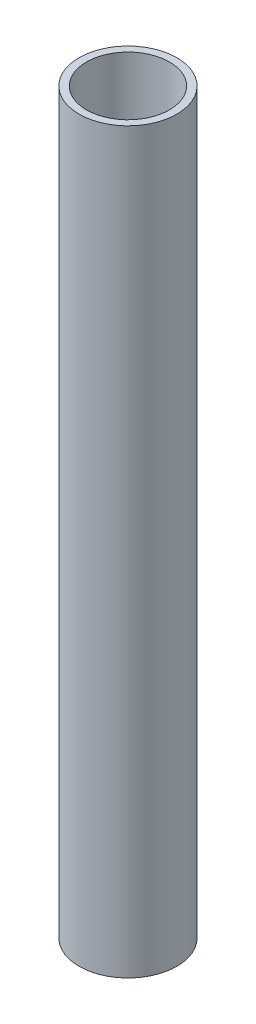
ISO-10303-21;
HEADER;
FILE_DESCRIPTION(('STEP AP214'),'2;1');
FILE_NAME('part.step','',(''),(''),'','','');
FILE_SCHEMA(('AUTOMOTIVE_DESIGN { 1 0 10303 214 1 1 1 1 }'));
ENDSEC;
DATA;
#1=APPLICATION_CONTEXT('core data for automotive mechanical design processes');
#2=APPLICATION_PROTOCOL_DEFINITION('international standard','automotive_design',2000,#1);
#3=PRODUCT_CONTEXT('',#1,'mechanical');
#4=PRODUCT('Part','Part','',(#3));
#5=PRODUCT_RELATED_PRODUCT_CATEGORY('part','',(#4));
#6=PRODUCT_DEFINITION_FORMATION('','',#4);
#7=PRODUCT_DEFINITION_CONTEXT('part definition',#1,'design');
#8=PRODUCT_DEFINITION('design','',#6,#7);
#9=PRODUCT_DEFINITION_SHAPE('','',#8);
#10=(LENGTH_UNIT() NAMED_UNIT(*) SI_UNIT(.MILLI.,.METRE.));
#11=(NAMED_UNIT(*) PLANE_ANGLE_UNIT() SI_UNIT($,.RADIAN.));
#12=(NAMED_UNIT(*) SI_UNIT($,.STERADIAN.) SOLID_ANGLE_UNIT());
#13=UNCERTAINTY_MEASURE_WITH_UNIT(LENGTH_MEASURE(1.E-05),#10,'distance_accuracy_value','');
#14=(GEOMETRIC_REPRESENTATION_CONTEXT(3) GLOBAL_UNCERTAINTY_ASSIGNED_CONTEXT((#13)) GLOBAL_UNIT_ASSIGNED_CONTEXT((#10,
#11,#12)) REPRESENTATION_CONTEXT('',''));
#15=CARTESIAN_POINT('',(0.,0.,0.));
#16=DIRECTION('',(0.,0.,1.));
#17=DIRECTION('',(1.,0.,0.));
#18=AXIS2_PLACEMENT_3D('',#15,#16,#17);
#19=CARTESIAN_POINT('',(0.,120.,0.));
#20=DIRECTION('',(0.,-1.,0.));
#21=DIRECTION('',(0.,0.,-1.));
#22=AXIS2_PLACEMENT_3D('',#19,#20,#21);
#23=CYLINDRICAL_SURFACE('',#22,6.75);
#24=CARTESIAN_POINT('',(0.,120.,0.));
#25=DIRECTION('',(0.,1.,0.));
#26=DIRECTION('',(0.,0.,1.));
#27=AXIS2_PLACEMENT_3D('',#24,#25,#26);
#28=CIRCLE('',#27,6.75);
#29=CARTESIAN_POINT('',(0.,120.,6.75));
#30=VERTEX_POINT('',#29);
#31=EDGE_CURVE('E45',#30,#30,#28,.T.);
#32=ORIENTED_EDGE('',*,*,#31,.T.);
#33=EDGE_LOOP('',(#32));
#34=FACE_BOUND('',#33,.T.);
#35=CARTESIAN_POINT('',(0.,0.,0.));
#36=DIRECTION('',(0.,1.,0.));
#37=DIRECTION('',(0.,0.,1.));
#38=AXIS2_PLACEMENT_3D('',#35,#36,#37);
#39=CIRCLE('',#38,6.75);
#40=CARTESIAN_POINT('',(0.,0.,6.75));
#41=VERTEX_POINT('',#40);
#42=EDGE_CURVE('E52',#41,#41,#39,.T.);
#43=ORIENTED_EDGE('',*,*,#42,.F.);
#44=EDGE_LOOP('',(#43));
#45=FACE_BOUND('',#44,.T.);
#46=ADVANCED_FACE('F37',(#34,#45),#23,.F.);
#47=CARTESIAN_POINT('',(0.,120.,0.));
#48=DIRECTION('',(0.,-1.,0.));
#49=DIRECTION('',(0.,0.,-1.));
#50=AXIS2_PLACEMENT_3D('',#47,#48,#49);
#51=CYLINDRICAL_SURFACE('',#50,7.95);
#52=CARTESIAN_POINT('',(0.,120.,0.));
#53=DIRECTION('',(0.,1.,0.));
#54=DIRECTION('',(0.,0.,1.));
#55=AXIS2_PLACEMENT_3D('',#52,#53,#54);
#56=CIRCLE('',#55,7.95);
#57=CARTESIAN_POINT('',(0.,120.,7.95));
#58=VERTEX_POINT('',#57);
#59=EDGE_CURVE('E10',#58,#58,#56,.T.);
#60=ORIENTED_EDGE('',*,*,#59,.F.);
#61=EDGE_LOOP('',(#60));
#62=FACE_BOUND('',#61,.T.);
#63=CARTESIAN_POINT('',(0.,0.,0.));
#64=DIRECTION('',(0.,1.,0.));
#65=DIRECTION('',(0.,0.,1.));
#66=AXIS2_PLACEMENT_3D('',#63,#64,#65);
#67=CIRCLE('',#66,7.95);
#68=CARTESIAN_POINT('',(0.,0.,7.95));
#69=VERTEX_POINT('',#68);
#70=EDGE_CURVE('E40',#69,#69,#67,.T.);
#71=ORIENTED_EDGE('',*,*,#70,.T.);
#72=EDGE_LOOP('',(#71));
#73=FACE_BOUND('',#72,.T.);
#74=ADVANCED_FACE('F61',(#62,#73),#51,.T.);
#75=CARTESIAN_POINT('',(0.,120.,0.));
#76=DIRECTION('',(0.,1.,0.));
#77=DIRECTION('',(0.,0.,1.));
#78=AXIS2_PLACEMENT_3D('',#75,#76,#77);
#79=PLANE('',#78);
#80=ORIENTED_EDGE('',*,*,#31,.F.);
#81=EDGE_LOOP('',(#80));
#82=FACE_BOUND('',#81,.T.);
#83=ORIENTED_EDGE('',*,*,#59,.T.);
#84=EDGE_LOOP('',(#83));
#85=FACE_BOUND('',#84,.T.);
#86=ADVANCED_FACE('F65',(#82,#85),#79,.T.);
#87=CARTESIAN_POINT('',(0.,0.,0.));
#88=DIRECTION('',(0.,1.,0.));
#89=DIRECTION('',(0.,0.,1.));
#90=AXIS2_PLACEMENT_3D('',#87,#88,#89);
#91=PLANE('',#90);
#92=ORIENTED_EDGE('',*,*,#42,.T.);
#93=EDGE_LOOP('',(#92));
#94=FACE_BOUND('',#93,.T.);
#95=ORIENTED_EDGE('',*,*,#70,.F.);
#96=EDGE_LOOP('',(#95));
#97=FACE_BOUND('',#96,.T.);
#98=ADVANCED_FACE('F63',(#94,#97),#91,.F.);
#99=CLOSED_SHELL('',(#46,#74,#86,#98));
#100=MANIFOLD_SOLID_BREP('B2',#99);
#101=ADVANCED_BREP_SHAPE_REPRESENTATION('',(#18,#100),#14);
#102=SHAPE_DEFINITION_REPRESENTATION(#9,#101);
ENDSEC;
END-ISO-10303-21;
